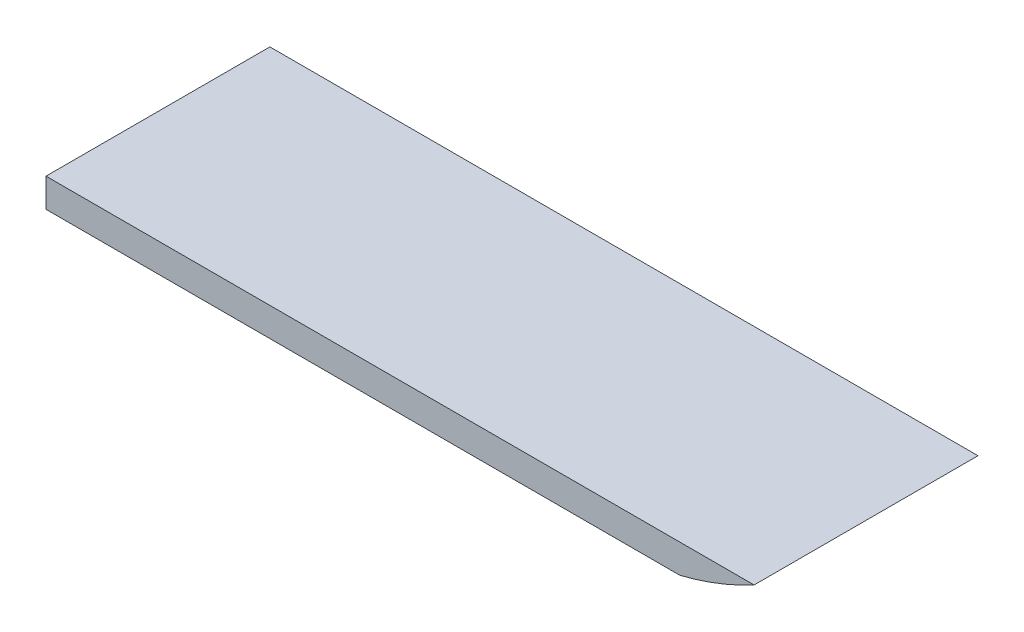
ISO-10303-21;
HEADER;
FILE_DESCRIPTION(('STEP AP214'),'2;1');
FILE_NAME('part.step','',(''),(''),'','','');
FILE_SCHEMA(('AUTOMOTIVE_DESIGN { 1 0 10303 214 1 1 1 1 }'));
ENDSEC;
DATA;
#1=APPLICATION_CONTEXT('core data for automotive mechanical design processes');
#2=APPLICATION_PROTOCOL_DEFINITION('international standard','automotive_design',2000,#1);
#3=PRODUCT_CONTEXT('',#1,'mechanical');
#4=PRODUCT('Part','Part','',(#3));
#5=PRODUCT_RELATED_PRODUCT_CATEGORY('part','',(#4));
#6=PRODUCT_DEFINITION_FORMATION('','',#4);
#7=PRODUCT_DEFINITION_CONTEXT('part definition',#1,'design');
#8=PRODUCT_DEFINITION('design','',#6,#7);
#9=PRODUCT_DEFINITION_SHAPE('','',#8);
#10=(LENGTH_UNIT() NAMED_UNIT(*) SI_UNIT(.MILLI.,.METRE.));
#11=(NAMED_UNIT(*) PLANE_ANGLE_UNIT() SI_UNIT($,.RADIAN.));
#12=(NAMED_UNIT(*) SI_UNIT($,.STERADIAN.) SOLID_ANGLE_UNIT());
#13=UNCERTAINTY_MEASURE_WITH_UNIT(LENGTH_MEASURE(1.E-05),#10,'distance_accuracy_value','');
#14=(GEOMETRIC_REPRESENTATION_CONTEXT(3) GLOBAL_UNCERTAINTY_ASSIGNED_CONTEXT((#13)) GLOBAL_UNIT_ASSIGNED_CONTEXT((#10,
#11,#12)) REPRESENTATION_CONTEXT('',''));
#15=CARTESIAN_POINT('',(0.,0.,0.));
#16=DIRECTION('',(0.,0.,1.));
#17=DIRECTION('',(1.,0.,0.));
#18=AXIS2_PLACEMENT_3D('',#15,#16,#17);
#19=CARTESIAN_POINT('',(-26.871812170946,6.011699918327,0.));
#20=DIRECTION('',(0.,0.,1.));
#21=DIRECTION('',(0.241040007220589,-0.970515180159022,0.));
#22=AXIS2_PLACEMENT_3D('',#19,#20,#21);
#23=CYLINDRICAL_SURFACE('',#22,0.14124653760403);
#24=CARTESIAN_POINT('',(-26.871812170946,6.011699918327,0.));
#25=DIRECTION('',(0.,0.,1.));
#26=DIRECTION('',(0.241040007220589,-0.970515180159022,0.));
#27=AXIS2_PLACEMENT_3D('',#24,#25,#26);
#28=CIRCLE('',#27,0.14124653760403);
#29=CARTESIAN_POINT('',(-26.837766104502,5.874618009437,0.));
#30=VERTEX_POINT('',#29);
#31=CARTESIAN_POINT('',(-26.804608304789,5.887465362914,0.));
#32=VERTEX_POINT('',#31);
#33=EDGE_CURVE('E11',#30,#32,#28,.T.);
#34=ORIENTED_EDGE('',*,*,#33,.T.);
#35=DIRECTION('',(0.,0.,1.));
#36=VECTOR('',#35,1.);
#37=CARTESIAN_POINT('',(-26.804608304789,5.887465362914,0.));
#38=LINE('',#37,#36);
#39=CARTESIAN_POINT('',(-26.804608304789,5.887465362914,0.1));
#40=VERTEX_POINT('',#39);
#41=EDGE_CURVE('E24',#32,#40,#38,.T.);
#42=ORIENTED_EDGE('',*,*,#41,.T.);
#43=CARTESIAN_POINT('',(-26.871812170946,6.011699918327,0.1));
#44=DIRECTION('',(0.,0.,1.));
#45=DIRECTION('',(0.241040007220589,-0.970515180159022,0.));
#46=AXIS2_PLACEMENT_3D('',#43,#44,#45);
#47=CIRCLE('',#46,0.14124653760403);
#48=CARTESIAN_POINT('',(-26.837766104502,5.874618009437,0.1));
#49=VERTEX_POINT('',#48);
#50=EDGE_CURVE('E75',#49,#40,#47,.T.);
#51=ORIENTED_EDGE('',*,*,#50,.F.);
#52=DIRECTION('',(0.,0.,1.));
#53=VECTOR('',#52,1.);
#54=CARTESIAN_POINT('',(-26.837766104502,5.874618009437,0.));
#55=LINE('',#54,#53);
#56=EDGE_CURVE('E86',#30,#49,#55,.T.);
#57=ORIENTED_EDGE('',*,*,#56,.F.);
#58=EDGE_LOOP('',(#34,#42,#51,#57));
#59=FACE_BOUND('',#58,.T.);
#60=ADVANCED_FACE('F17',(#59),#23,.T.);
#61=CARTESIAN_POINT('',(-27.120912466168,5.874618009437,0.));
#62=DIRECTION('',(0.,-1.,0.));
#63=DIRECTION('',(1.,0.,0.));
#64=AXIS2_PLACEMENT_3D('',#61,#62,#63);
#65=PLANE('',#64);
#66=DIRECTION('',(1.,0.,0.));
#67=VECTOR('',#66,1.);
#68=CARTESIAN_POINT('',(-27.120912466168,5.874618009437,0.));
#69=LINE('',#68,#67);
#70=CARTESIAN_POINT('',(-27.120912466168,5.874618009437,0.));
#71=VERTEX_POINT('',#70);
#72=EDGE_CURVE('E83',#71,#30,#69,.T.);
#73=ORIENTED_EDGE('',*,*,#72,.T.);
#74=ORIENTED_EDGE('',*,*,#56,.T.);
#75=DIRECTION('',(1.,0.,0.));
#76=VECTOR('',#75,1.);
#77=CARTESIAN_POINT('',(-27.120912466168,5.874618009437,0.1));
#78=LINE('',#77,#76);
#79=CARTESIAN_POINT('',(-27.120912466168,5.874618009437,0.1));
#80=VERTEX_POINT('',#79);
#81=EDGE_CURVE('E81',#80,#49,#78,.T.);
#82=ORIENTED_EDGE('',*,*,#81,.F.);
#83=DIRECTION('',(0.,0.,1.));
#84=VECTOR('',#83,1.);
#85=CARTESIAN_POINT('',(-27.120912466168,5.874618009437,0.));
#86=LINE('',#85,#84);
#87=EDGE_CURVE('E61',#71,#80,#86,.T.);
#88=ORIENTED_EDGE('',*,*,#87,.F.);
#89=EDGE_LOOP('',(#73,#74,#82,#88));
#90=FACE_BOUND('',#89,.T.);
#91=ADVANCED_FACE('F91',(#90),#65,.T.);
#92=CARTESIAN_POINT('',(-27.120912466168,5.887465362914,0.));
#93=DIRECTION('',(-1.,0.,0.));
#94=DIRECTION('',(0.,-1.,0.));
#95=AXIS2_PLACEMENT_3D('',#92,#93,#94);
#96=PLANE('',#95);
#97=DIRECTION('',(0.,-1.,0.));
#98=VECTOR('',#97,1.);
#99=CARTESIAN_POINT('',(-27.120912466168,5.887465362914,0.));
#100=LINE('',#99,#98);
#101=CARTESIAN_POINT('',(-27.120912466168,5.887465362914,0.));
#102=VERTEX_POINT('',#101);
#103=EDGE_CURVE('E65',#102,#71,#100,.T.);
#104=ORIENTED_EDGE('',*,*,#103,.T.);
#105=ORIENTED_EDGE('',*,*,#87,.T.);
#106=DIRECTION('',(0.,-1.,0.));
#107=VECTOR('',#106,1.);
#108=CARTESIAN_POINT('',(-27.120912466168,5.887465362914,0.1));
#109=LINE('',#108,#107);
#110=CARTESIAN_POINT('',(-27.120912466168,5.887465362914,0.1));
#111=VERTEX_POINT('',#110);
#112=EDGE_CURVE('E54',#111,#80,#109,.T.);
#113=ORIENTED_EDGE('',*,*,#112,.F.);
#114=DIRECTION('',(0.,0.,1.));
#115=VECTOR('',#114,1.);
#116=CARTESIAN_POINT('',(-27.120912466168,5.887465362914,0.));
#117=LINE('',#116,#115);
#118=EDGE_CURVE('E58',#102,#111,#117,.T.);
#119=ORIENTED_EDGE('',*,*,#118,.F.);
#120=EDGE_LOOP('',(#104,#105,#113,#119));
#121=FACE_BOUND('',#120,.T.);
#122=ADVANCED_FACE('F57',(#121),#96,.T.);
#123=CARTESIAN_POINT('',(-26.804608304789,5.887465362914,0.));
#124=DIRECTION('',(0.,1.,0.));
#125=DIRECTION('',(-1.,0.,0.));
#126=AXIS2_PLACEMENT_3D('',#123,#124,#125);
#127=PLANE('',#126);
#128=DIRECTION('',(-1.,0.,0.));
#129=VECTOR('',#128,1.);
#130=CARTESIAN_POINT('',(-26.804608304789,5.887465362914,0.));
#131=LINE('',#130,#129);
#132=EDGE_CURVE('E71',#32,#102,#131,.T.);
#133=ORIENTED_EDGE('',*,*,#132,.T.);
#134=ORIENTED_EDGE('',*,*,#118,.T.);
#135=DIRECTION('',(-1.,0.,0.));
#136=VECTOR('',#135,1.);
#137=CARTESIAN_POINT('',(-26.804608304789,5.887465362914,0.1));
#138=LINE('',#137,#136);
#139=EDGE_CURVE('E70',#40,#111,#138,.T.);
#140=ORIENTED_EDGE('',*,*,#139,.F.);
#141=ORIENTED_EDGE('',*,*,#41,.F.);
#142=EDGE_LOOP('',(#133,#134,#140,#141));
#143=FACE_BOUND('',#142,.T.);
#144=ADVANCED_FACE('F69',(#143),#127,.T.);
#145=CARTESIAN_POINT('',(-26.967350226588,5.881345773755,0.1));
#146=DIRECTION('',(0.,0.,1.));
#147=DIRECTION('',(1.,0.,0.));
#148=AXIS2_PLACEMENT_3D('',#145,#146,#147);
#149=PLANE('',#148);
#150=ORIENTED_EDGE('',*,*,#139,.T.);
#151=ORIENTED_EDGE('',*,*,#112,.T.);
#152=ORIENTED_EDGE('',*,*,#81,.T.);
#153=ORIENTED_EDGE('',*,*,#50,.T.);
#154=EDGE_LOOP('',(#150,#151,#152,#153));
#155=FACE_BOUND('',#154,.T.);
#156=ADVANCED_FACE('F74',(#155),#149,.T.);
#157=CARTESIAN_POINT('',(-26.967350226588,5.881345773755,0.));
#158=DIRECTION('',(0.,0.,1.));
#159=DIRECTION('',(1.,0.,0.));
#160=AXIS2_PLACEMENT_3D('',#157,#158,#159);
#161=PLANE('',#160);
#162=ORIENTED_EDGE('',*,*,#132,.F.);
#163=ORIENTED_EDGE('',*,*,#33,.F.);
#164=ORIENTED_EDGE('',*,*,#72,.F.);
#165=ORIENTED_EDGE('',*,*,#103,.F.);
#166=EDGE_LOOP('',(#162,#163,#164,#165));
#167=FACE_BOUND('',#166,.T.);
#168=ADVANCED_FACE('F89',(#167),#161,.F.);
#169=CLOSED_SHELL('',(#60,#91,#122,#144,#156,#168));
#170=MANIFOLD_SOLID_BREP('B1',#169);
#171=ADVANCED_BREP_SHAPE_REPRESENTATION('',(#18,#170),#14);
#172=SHAPE_DEFINITION_REPRESENTATION(#9,#171);
ENDSEC;
END-ISO-10303-21;
